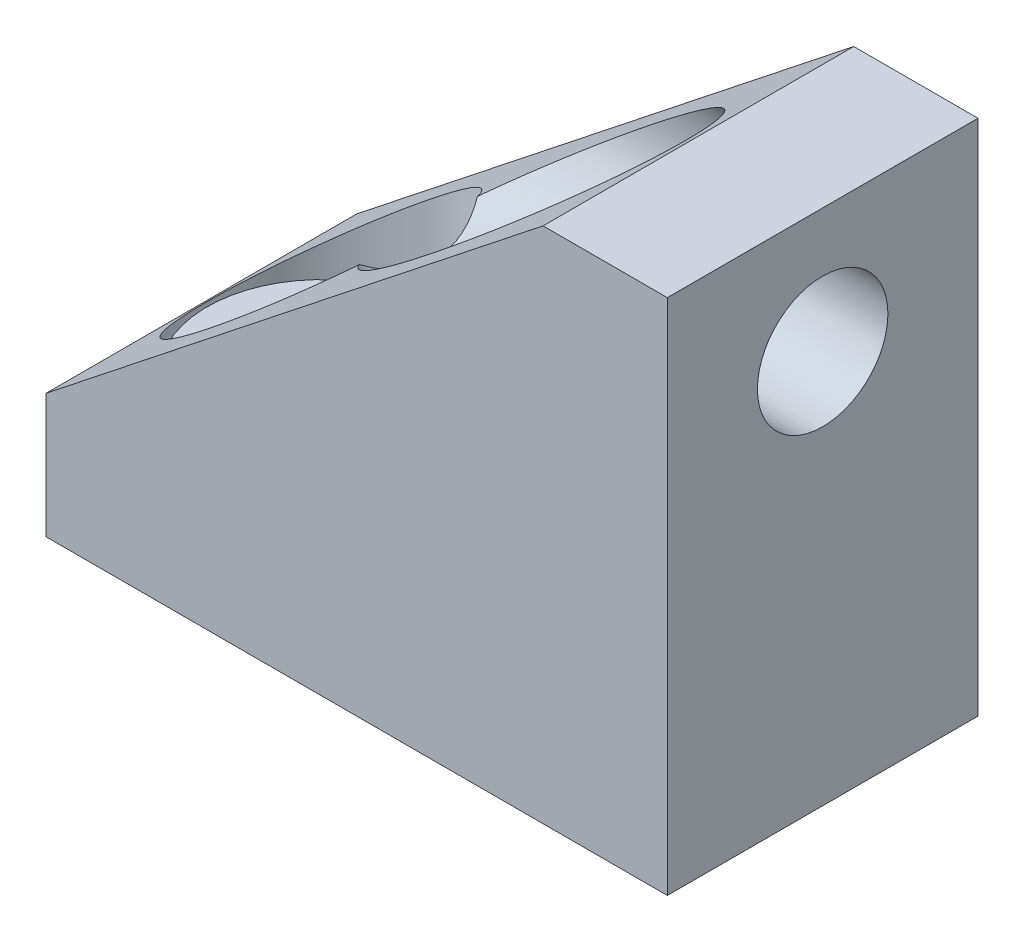
ISO-10303-21;
HEADER;
FILE_DESCRIPTION(('STEP AP214'),'2;1');
FILE_NAME('part.step','',(''),(''),'','','');
FILE_SCHEMA(('AUTOMOTIVE_DESIGN { 1 0 10303 214 1 1 1 1 }'));
ENDSEC;
DATA;
#1=APPLICATION_CONTEXT('core data for automotive mechanical design processes');
#2=APPLICATION_PROTOCOL_DEFINITION('international standard','automotive_design',2000,#1);
#3=PRODUCT_CONTEXT('',#1,'mechanical');
#4=PRODUCT('Part','Part','',(#3));
#5=PRODUCT_RELATED_PRODUCT_CATEGORY('part','',(#4));
#6=PRODUCT_DEFINITION_FORMATION('','',#4);
#7=PRODUCT_DEFINITION_CONTEXT('part definition',#1,'design');
#8=PRODUCT_DEFINITION('design','',#6,#7);
#9=PRODUCT_DEFINITION_SHAPE('','',#8);
#10=(LENGTH_UNIT() NAMED_UNIT(*) SI_UNIT(.MILLI.,.METRE.));
#11=(NAMED_UNIT(*) PLANE_ANGLE_UNIT() SI_UNIT($,.RADIAN.));
#12=(NAMED_UNIT(*) SI_UNIT($,.STERADIAN.) SOLID_ANGLE_UNIT());
#13=UNCERTAINTY_MEASURE_WITH_UNIT(LENGTH_MEASURE(1.E-05),#10,'distance_accuracy_value','');
#14=(GEOMETRIC_REPRESENTATION_CONTEXT(3) GLOBAL_UNCERTAINTY_ASSIGNED_CONTEXT((#13)) GLOBAL_UNIT_ASSIGNED_CONTEXT((#10,
#11,#12)) REPRESENTATION_CONTEXT('',''));
#15=CARTESIAN_POINT('',(0.,0.,0.));
#16=DIRECTION('',(0.,0.,1.));
#17=DIRECTION('',(1.,0.,0.));
#18=AXIS2_PLACEMENT_3D('',#15,#16,#17);
#19=CARTESIAN_POINT('',(0.295848230896214,-0.373703028500481,15.));
#20=DIRECTION('',(-0.620702944365561,0.784045824461761,0.));
#21=DIRECTION('',(-0.784045824461761,-0.620702944365561,0.));
#22=AXIS2_PLACEMENT_3D('',#19,#20,#21);
#23=PLANE('',#22);
#24=DIRECTION('',(0.784045824461761,0.620702944365561,0.));
#25=VECTOR('',#24,1.);
#26=CARTESIAN_POINT('',(0.295848230896214,-0.373703028500481,0.));
#27=LINE('',#26,#25);
#28=CARTESIAN_POINT('',(8.34684153005472,6.,0.));
#29=VERTEX_POINT('',#28);
#30=CARTESIAN_POINT('',(32.3468415300547,25.,0.));
#31=VERTEX_POINT('',#30);
#32=EDGE_CURVE('E134',#29,#31,#27,.T.);
#33=ORIENTED_EDGE('',*,*,#32,.F.);
#34=DIRECTION('',(0.,0.,-1.));
#35=VECTOR('',#34,1.);
#36=CARTESIAN_POINT('',(8.34684153005472,6.,15.));
#37=LINE('',#36,#35);
#38=CARTESIAN_POINT('',(8.34684153005472,6.,15.));
#39=VERTEX_POINT('',#38);
#40=EDGE_CURVE('E55',#39,#29,#37,.T.);
#41=ORIENTED_EDGE('',*,*,#40,.F.);
#42=DIRECTION('',(0.784045824461761,0.620702944365561,0.));
#43=VECTOR('',#42,1.);
#44=CARTESIAN_POINT('',(0.295848230896214,-0.373703028500481,15.));
#45=LINE('',#44,#43);
#46=CARTESIAN_POINT('',(32.3468415300547,25.,15.));
#47=VERTEX_POINT('',#46);
#48=EDGE_CURVE('E151',#39,#47,#45,.T.);
#49=ORIENTED_EDGE('',*,*,#48,.T.);
#50=DIRECTION('',(0.,0.,-1.));
#51=VECTOR('',#50,1.);
#52=CARTESIAN_POINT('',(32.3468415300547,25.,15.));
#53=LINE('',#52,#51);
#54=EDGE_CURVE('E93',#47,#31,#53,.T.);
#55=ORIENTED_EDGE('',*,*,#54,.T.);
#56=EDGE_LOOP('',(#33,#41,#49,#55));
#57=FACE_BOUND('',#56,.T.);
#58=CARTESIAN_POINT('',(14.1208325300547,10.5710762083333,7.5));
#59=DIRECTION('',(-0.620702944365561,0.784045824461761,0.));
#60=DIRECTION('',(0.784045824461761,0.620702944365561,0.));
#61=AXIS2_PLACEMENT_3D('',#58,#59,#60);
#62=ELLIPSE('',#61,7.01489610479806,5.5);
#63=CARTESIAN_POINT('',(18.8253481347059,14.2954843953488,4.65087154982552));
#64=VERTEX_POINT('',#63);
#65=CARTESIAN_POINT('',(18.8253481347059,14.2954843953488,10.3491284501745));
#66=VERTEX_POINT('',#65);
#67=EDGE_CURVE('E159',#64,#66,#62,.T.);
#68=ORIENTED_EDGE('',*,*,#67,.F.);
#69=CARTESIAN_POINT('',(24.7678941616337,19.,7.49999999999999));
#70=DIRECTION('',(-0.620702944365561,0.784045824461761,0.));
#71=DIRECTION('',(-0.784045824461761,-0.620702944365561,0.));
#72=AXIS2_PLACEMENT_3D('',#69,#70,#71);
#73=ELLIPSE('',#72,8.8609213955344,5.5);
#74=EDGE_CURVE('E60',#64,#66,#73,.F.);
#75=ORIENTED_EDGE('',*,*,#74,.T.);
#76=EDGE_LOOP('',(#68,#75));
#77=FACE_BOUND('',#76,.T.);
#78=ADVANCED_FACE('F47',(#57,#77),#23,.T.);
#79=CARTESIAN_POINT('',(14.1208325300547,6.,7.5));
#80=DIRECTION('',(0.,1.,0.));
#81=DIRECTION('',(0.,0.,1.));
#82=AXIS2_PLACEMENT_3D('',#79,#80,#81);
#83=CYLINDRICAL_SURFACE('',#82,5.5);
#84=CARTESIAN_POINT('',(14.1208325300547,6.,7.5));
#85=DIRECTION('',(0.,1.,0.));
#86=DIRECTION('',(0.,0.,1.));
#87=AXIS2_PLACEMENT_3D('',#84,#85,#86);
#88=CIRCLE('',#87,5.5);
#89=CARTESIAN_POINT('',(14.1208325300547,6.,13.));
#90=VERTEX_POINT('',#89);
#91=EDGE_CURVE('E162',#90,#90,#88,.T.);
#92=ORIENTED_EDGE('',*,*,#91,.F.);
#93=EDGE_LOOP('',(#92));
#94=FACE_BOUND('',#93,.T.);
#95=CARTESIAN_POINT('',(14.1208325300547,19.,7.5));
#96=DIRECTION('',(0.707106781186547,0.707106781186547,0.));
#97=DIRECTION('',(-0.707106781186547,0.707106781186547,0.));
#98=AXIS2_PLACEMENT_3D('',#95,#96,#97);
#99=ELLIPSE('',#98,7.77817459305202,5.5);
#100=EDGE_CURVE('E12',#64,#66,#99,.F.);
#101=ORIENTED_EDGE('',*,*,#100,.F.);
#102=ORIENTED_EDGE('',*,*,#67,.T.);
#103=EDGE_LOOP('',(#101,#102));
#104=FACE_BOUND('',#103,.T.);
#105=ADVANCED_FACE('F192',(#94,#104),#83,.F.);
#106=CARTESIAN_POINT('',(38.3468415300547,19.,7.49999999999999));
#107=DIRECTION('',(-1.,0.,0.));
#108=DIRECTION('',(0.,0.,1.));
#109=AXIS2_PLACEMENT_3D('',#106,#107,#108);
#110=CYLINDRICAL_SURFACE('',#109,3.15);
#111=CARTESIAN_POINT('',(38.3468415300547,19.,7.49999999999999));
#112=DIRECTION('',(1.,0.,0.));
#113=DIRECTION('',(0.,0.,-1.));
#114=AXIS2_PLACEMENT_3D('',#111,#112,#113);
#115=CIRCLE('',#114,3.15);
#116=CARTESIAN_POINT('',(38.3468415300547,19.,4.34999999999999));
#117=VERTEX_POINT('',#116);
#118=EDGE_CURVE('E176',#117,#117,#115,.T.);
#119=ORIENTED_EDGE('',*,*,#118,.T.);
#120=EDGE_LOOP('',(#119));
#121=FACE_BOUND('',#120,.T.);
#122=CARTESIAN_POINT('',(32.3468415300547,19.,7.49999999999999));
#123=DIRECTION('',(-1.,0.,0.));
#124=DIRECTION('',(0.,0.,1.));
#125=AXIS2_PLACEMENT_3D('',#122,#123,#124);
#126=CIRCLE('',#125,3.15);
#127=CARTESIAN_POINT('',(32.3468415300547,19.,10.65));
#128=VERTEX_POINT('',#127);
#129=EDGE_CURVE('E194',#128,#128,#126,.T.);
#130=ORIENTED_EDGE('',*,*,#129,.T.);
#131=EDGE_LOOP('',(#130));
#132=FACE_BOUND('',#131,.T.);
#133=ADVANCED_FACE('F222',(#121,#132),#110,.F.);
#134=CARTESIAN_POINT('',(14.1208325300547,0.,7.5));
#135=DIRECTION('',(0.,1.,0.));
#136=DIRECTION('',(0.,0.,1.));
#137=AXIS2_PLACEMENT_3D('',#134,#135,#136);
#138=CYLINDRICAL_SURFACE('',#137,3.15);
#139=CARTESIAN_POINT('',(14.1208325300547,0.,7.5));
#140=DIRECTION('',(0.,1.,0.));
#141=DIRECTION('',(0.,0.,1.));
#142=AXIS2_PLACEMENT_3D('',#139,#140,#141);
#143=CIRCLE('',#142,3.15);
#144=CARTESIAN_POINT('',(14.1208325300547,0.,10.65));
#145=VERTEX_POINT('',#144);
#146=EDGE_CURVE('E139',#145,#145,#143,.T.);
#147=ORIENTED_EDGE('',*,*,#146,.F.);
#148=EDGE_LOOP('',(#147));
#149=FACE_BOUND('',#148,.T.);
#150=CARTESIAN_POINT('',(14.1208325300547,6.,7.5));
#151=DIRECTION('',(0.,1.,0.));
#152=DIRECTION('',(0.,0.,1.));
#153=AXIS2_PLACEMENT_3D('',#150,#151,#152);
#154=CIRCLE('',#153,3.15);
#155=CARTESIAN_POINT('',(14.1208325300547,6.,10.65));
#156=VERTEX_POINT('',#155);
#157=EDGE_CURVE('E170',#156,#156,#154,.T.);
#158=ORIENTED_EDGE('',*,*,#157,.T.);
#159=EDGE_LOOP('',(#158));
#160=FACE_BOUND('',#159,.T.);
#161=ADVANCED_FACE('F224',(#149,#160),#138,.F.);
#162=CARTESIAN_POINT('',(8.34684153005472,0.,15.));
#163=DIRECTION('',(-1.,0.,0.));
#164=DIRECTION('',(0.,0.,1.));
#165=AXIS2_PLACEMENT_3D('',#162,#163,#164);
#166=PLANE('',#165);
#167=DIRECTION('',(0.,1.,0.));
#168=VECTOR('',#167,1.);
#169=CARTESIAN_POINT('',(8.34684153005472,0.,0.));
#170=LINE('',#169,#168);
#171=CARTESIAN_POINT('',(8.34684153005472,0.,0.));
#172=VERTEX_POINT('',#171);
#173=EDGE_CURVE('E138',#172,#29,#170,.T.);
#174=ORIENTED_EDGE('',*,*,#173,.F.);
#175=DIRECTION('',(0.,0.,-1.));
#176=VECTOR('',#175,1.);
#177=CARTESIAN_POINT('',(8.34684153005472,0.,15.));
#178=LINE('',#177,#176);
#179=CARTESIAN_POINT('',(8.34684153005472,0.,15.));
#180=VERTEX_POINT('',#179);
#181=EDGE_CURVE('E123',#180,#172,#178,.T.);
#182=ORIENTED_EDGE('',*,*,#181,.F.);
#183=DIRECTION('',(0.,1.,0.));
#184=VECTOR('',#183,1.);
#185=CARTESIAN_POINT('',(8.34684153005472,0.,15.));
#186=LINE('',#185,#184);
#187=EDGE_CURVE('E111',#180,#39,#186,.T.);
#188=ORIENTED_EDGE('',*,*,#187,.T.);
#189=ORIENTED_EDGE('',*,*,#40,.T.);
#190=EDGE_LOOP('',(#174,#182,#188,#189));
#191=FACE_BOUND('',#190,.T.);
#192=ADVANCED_FACE('F184',(#191),#166,.T.);
#193=CARTESIAN_POINT('',(0.,0.,15.));
#194=DIRECTION('',(0.,1.,0.));
#195=DIRECTION('',(0.,0.,1.));
#196=AXIS2_PLACEMENT_3D('',#193,#194,#195);
#197=PLANE('',#196);
#198=ORIENTED_EDGE('',*,*,#146,.T.);
#199=EDGE_LOOP('',(#198));
#200=FACE_BOUND('',#199,.T.);
#201=DIRECTION('',(1.,0.,0.));
#202=VECTOR('',#201,1.);
#203=CARTESIAN_POINT('',(0.,0.,0.));
#204=LINE('',#203,#202);
#205=CARTESIAN_POINT('',(38.3468415300547,0.,0.));
#206=VERTEX_POINT('',#205);
#207=EDGE_CURVE('E119',#172,#206,#204,.T.);
#208=ORIENTED_EDGE('',*,*,#207,.T.);
#209=DIRECTION('',(0.,0.,-1.));
#210=VECTOR('',#209,1.);
#211=CARTESIAN_POINT('',(38.3468415300547,0.,15.));
#212=LINE('',#211,#210);
#213=CARTESIAN_POINT('',(38.3468415300547,0.,15.));
#214=VERTEX_POINT('',#213);
#215=EDGE_CURVE('E116',#214,#206,#212,.T.);
#216=ORIENTED_EDGE('',*,*,#215,.F.);
#217=DIRECTION('',(1.,0.,0.));
#218=VECTOR('',#217,1.);
#219=CARTESIAN_POINT('',(0.,0.,15.));
#220=LINE('',#219,#218);
#221=EDGE_CURVE('E104',#180,#214,#220,.T.);
#222=ORIENTED_EDGE('',*,*,#221,.F.);
#223=ORIENTED_EDGE('',*,*,#181,.T.);
#224=EDGE_LOOP('',(#208,#216,#222,#223));
#225=FACE_BOUND('',#224,.T.);
#226=ADVANCED_FACE('F117',(#200,#225),#197,.F.);
#227=CARTESIAN_POINT('',(38.3468415300547,0.,15.));
#228=DIRECTION('',(-1.,0.,0.));
#229=DIRECTION('',(0.,0.,1.));
#230=AXIS2_PLACEMENT_3D('',#227,#228,#229);
#231=PLANE('',#230);
#232=ORIENTED_EDGE('',*,*,#118,.F.);
#233=EDGE_LOOP('',(#232));
#234=FACE_BOUND('',#233,.T.);
#235=DIRECTION('',(0.,1.,0.));
#236=VECTOR('',#235,1.);
#237=CARTESIAN_POINT('',(38.3468415300547,0.,0.));
#238=LINE('',#237,#236);
#239=CARTESIAN_POINT('',(38.3468415300547,25.,0.));
#240=VERTEX_POINT('',#239);
#241=EDGE_CURVE('E145',#206,#240,#238,.T.);
#242=ORIENTED_EDGE('',*,*,#241,.T.);
#243=DIRECTION('',(0.,0.,-1.));
#244=VECTOR('',#243,1.);
#245=CARTESIAN_POINT('',(38.3468415300547,25.,15.));
#246=LINE('',#245,#244);
#247=CARTESIAN_POINT('',(38.3468415300547,25.,15.));
#248=VERTEX_POINT('',#247);
#249=EDGE_CURVE('E124',#248,#240,#246,.T.);
#250=ORIENTED_EDGE('',*,*,#249,.F.);
#251=DIRECTION('',(0.,1.,0.));
#252=VECTOR('',#251,1.);
#253=CARTESIAN_POINT('',(38.3468415300547,0.,15.));
#254=LINE('',#253,#252);
#255=EDGE_CURVE('E108',#214,#248,#254,.T.);
#256=ORIENTED_EDGE('',*,*,#255,.F.);
#257=ORIENTED_EDGE('',*,*,#215,.T.);
#258=EDGE_LOOP('',(#242,#250,#256,#257));
#259=FACE_BOUND('',#258,.T.);
#260=ADVANCED_FACE('F126',(#234,#259),#231,.F.);
#261=CARTESIAN_POINT('',(0.,25.,15.));
#262=DIRECTION('',(0.,-1.,0.));
#263=DIRECTION('',(0.,0.,-1.));
#264=AXIS2_PLACEMENT_3D('',#261,#262,#263);
#265=PLANE('',#264);
#266=DIRECTION('',(-1.,0.,0.));
#267=VECTOR('',#266,1.);
#268=CARTESIAN_POINT('',(0.,25.,0.));
#269=LINE('',#268,#267);
#270=EDGE_CURVE('E148',#240,#31,#269,.T.);
#271=ORIENTED_EDGE('',*,*,#270,.T.);
#272=ORIENTED_EDGE('',*,*,#54,.F.);
#273=DIRECTION('',(-1.,0.,0.));
#274=VECTOR('',#273,1.);
#275=CARTESIAN_POINT('',(0.,25.,15.));
#276=LINE('',#275,#274);
#277=EDGE_CURVE('E69',#248,#47,#276,.T.);
#278=ORIENTED_EDGE('',*,*,#277,.F.);
#279=ORIENTED_EDGE('',*,*,#249,.T.);
#280=EDGE_LOOP('',(#271,#272,#278,#279));
#281=FACE_BOUND('',#280,.T.);
#282=ADVANCED_FACE('F189',(#281),#265,.F.);
#283=CARTESIAN_POINT('',(0.,0.,15.));
#284=DIRECTION('',(0.,0.,1.));
#285=DIRECTION('',(1.,0.,0.));
#286=AXIS2_PLACEMENT_3D('',#283,#284,#285);
#287=PLANE('',#286);
#288=ORIENTED_EDGE('',*,*,#48,.F.);
#289=ORIENTED_EDGE('',*,*,#187,.F.);
#290=ORIENTED_EDGE('',*,*,#221,.T.);
#291=ORIENTED_EDGE('',*,*,#255,.T.);
#292=ORIENTED_EDGE('',*,*,#277,.T.);
#293=EDGE_LOOP('',(#288,#289,#290,#291,#292));
#294=FACE_BOUND('',#293,.T.);
#295=ADVANCED_FACE('F106',(#294),#287,.T.);
#296=CARTESIAN_POINT('',(0.,0.,0.));
#297=DIRECTION('',(0.,0.,1.));
#298=DIRECTION('',(1.,0.,0.));
#299=AXIS2_PLACEMENT_3D('',#296,#297,#298);
#300=PLANE('',#299);
#301=ORIENTED_EDGE('',*,*,#32,.T.);
#302=ORIENTED_EDGE('',*,*,#270,.F.);
#303=ORIENTED_EDGE('',*,*,#241,.F.);
#304=ORIENTED_EDGE('',*,*,#207,.F.);
#305=ORIENTED_EDGE('',*,*,#173,.T.);
#306=EDGE_LOOP('',(#301,#302,#303,#304,#305));
#307=FACE_BOUND('',#306,.T.);
#308=ADVANCED_FACE('F186',(#307),#300,.F.);
#309=CARTESIAN_POINT('',(14.1208325300547,6.,7.5));
#310=DIRECTION('',(0.,1.,0.));
#311=DIRECTION('',(0.,0.,1.));
#312=AXIS2_PLACEMENT_3D('',#309,#310,#311);
#313=PLANE('',#312);
#314=ORIENTED_EDGE('',*,*,#157,.F.);
#315=EDGE_LOOP('',(#314));
#316=FACE_BOUND('',#315,.T.);
#317=ORIENTED_EDGE('',*,*,#91,.T.);
#318=EDGE_LOOP('',(#317));
#319=FACE_BOUND('',#318,.T.);
#320=ADVANCED_FACE('F211',(#316,#319),#313,.T.);
#321=CARTESIAN_POINT('',(53.9031907161588,19.,7.49999999999999));
#322=DIRECTION('',(-1.,0.,0.));
#323=DIRECTION('',(0.,0.,1.));
#324=AXIS2_PLACEMENT_3D('',#321,#322,#323);
#325=CYLINDRICAL_SURFACE('',#324,5.5);
#326=ORIENTED_EDGE('',*,*,#100,.T.);
#327=ORIENTED_EDGE('',*,*,#74,.F.);
#328=EDGE_LOOP('',(#326,#327));
#329=FACE_BOUND('',#328,.T.);
#330=CARTESIAN_POINT('',(32.3468415300547,19.,7.49999999999999));
#331=DIRECTION('',(-1.,0.,0.));
#332=DIRECTION('',(0.,0.,1.));
#333=AXIS2_PLACEMENT_3D('',#330,#331,#332);
#334=CIRCLE('',#333,5.5);
#335=CARTESIAN_POINT('',(32.3468415300547,19.,13.));
#336=VERTEX_POINT('',#335);
#337=EDGE_CURVE('E200',#336,#336,#334,.T.);
#338=ORIENTED_EDGE('',*,*,#337,.F.);
#339=EDGE_LOOP('',(#338));
#340=FACE_BOUND('',#339,.T.);
#341=ADVANCED_FACE('F209',(#329,#340),#325,.F.);
#342=CARTESIAN_POINT('',(32.3468415300547,0.,15.));
#343=DIRECTION('',(-1.,0.,0.));
#344=DIRECTION('',(0.,0.,1.));
#345=AXIS2_PLACEMENT_3D('',#342,#343,#344);
#346=PLANE('',#345);
#347=ORIENTED_EDGE('',*,*,#129,.F.);
#348=EDGE_LOOP('',(#347));
#349=FACE_BOUND('',#348,.T.);
#350=ORIENTED_EDGE('',*,*,#337,.T.);
#351=EDGE_LOOP('',(#350));
#352=FACE_BOUND('',#351,.T.);
#353=ADVANCED_FACE('F207',(#349,#352),#346,.T.);
#354=CLOSED_SHELL('',(#78,#105,#133,#161,#192,#226,#260,#282,#295,#308,#320,#341,#353));
#355=MANIFOLD_SOLID_BREP('B2',#354);
#356=ADVANCED_BREP_SHAPE_REPRESENTATION('',(#18,#355),#14);
#357=SHAPE_DEFINITION_REPRESENTATION(#9,#356);
ENDSEC;
END-ISO-10303-21;
